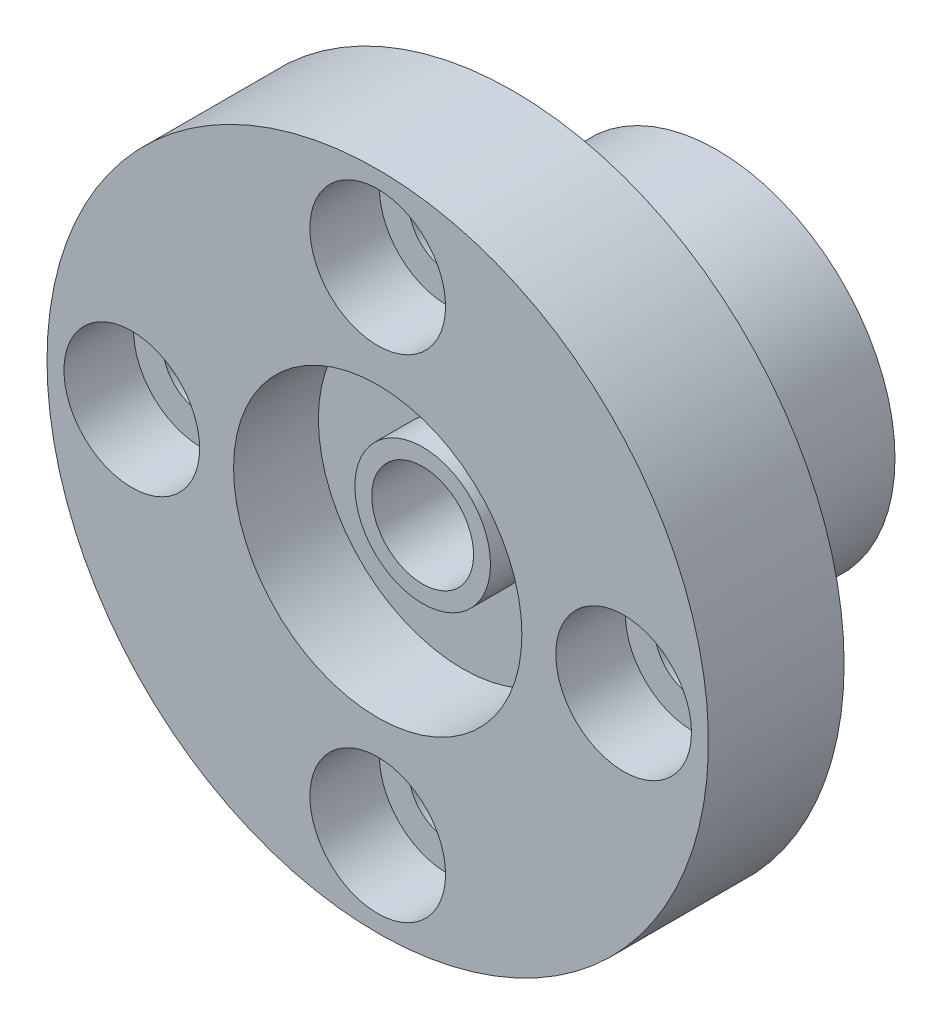
ISO-10303-21;
HEADER;
FILE_DESCRIPTION(('STEP AP214'),'2;1');
FILE_NAME('part.step','',(''),(''),'','','');
FILE_SCHEMA(('AUTOMOTIVE_DESIGN { 1 0 10303 214 1 1 1 1 }'));
ENDSEC;
DATA;
#1=APPLICATION_CONTEXT('core data for automotive mechanical design processes');
#2=APPLICATION_PROTOCOL_DEFINITION('international standard','automotive_design',2000,#1);
#3=PRODUCT_CONTEXT('',#1,'mechanical');
#4=PRODUCT('Part','Part','',(#3));
#5=PRODUCT_RELATED_PRODUCT_CATEGORY('part','',(#4));
#6=PRODUCT_DEFINITION_FORMATION('','',#4);
#7=PRODUCT_DEFINITION_CONTEXT('part definition',#1,'design');
#8=PRODUCT_DEFINITION('design','',#6,#7);
#9=PRODUCT_DEFINITION_SHAPE('','',#8);
#10=(LENGTH_UNIT() NAMED_UNIT(*) SI_UNIT(.MILLI.,.METRE.));
#11=(NAMED_UNIT(*) PLANE_ANGLE_UNIT() SI_UNIT($,.RADIAN.));
#12=(NAMED_UNIT(*) SI_UNIT($,.STERADIAN.) SOLID_ANGLE_UNIT());
#13=UNCERTAINTY_MEASURE_WITH_UNIT(LENGTH_MEASURE(1.E-05),#10,'distance_accuracy_value','');
#14=(GEOMETRIC_REPRESENTATION_CONTEXT(3) GLOBAL_UNCERTAINTY_ASSIGNED_CONTEXT((#13)) GLOBAL_UNIT_ASSIGNED_CONTEXT((#10,
#11,#12)) REPRESENTATION_CONTEXT('',''));
#15=CARTESIAN_POINT('',(0.,0.,0.));
#16=DIRECTION('',(0.,0.,1.));
#17=DIRECTION('',(1.,0.,0.));
#18=AXIS2_PLACEMENT_3D('',#15,#16,#17);
#19=CARTESIAN_POINT('',(0.,0.,10.65));
#20=DIRECTION('',(0.,0.,-1.));
#21=DIRECTION('',(-1.,0.,0.));
#22=AXIS2_PLACEMENT_3D('',#19,#20,#21);
#23=CYLINDRICAL_SURFACE('',#22,3.);
#24=CARTESIAN_POINT('',(0.,0.,-9.35));
#25=DIRECTION('',(0.,0.,-1.));
#26=DIRECTION('',(-1.,0.,0.));
#27=AXIS2_PLACEMENT_3D('',#24,#25,#26);
#28=CIRCLE('',#27,3.);
#29=CARTESIAN_POINT('',(-3.,0.,-9.35));
#30=VERTEX_POINT('',#29);
#31=EDGE_CURVE('E379',#30,#30,#28,.T.);
#32=ORIENTED_EDGE('',*,*,#31,.T.);
#33=EDGE_LOOP('',(#32));
#34=FACE_BOUND('',#33,.T.);
#35=CARTESIAN_POINT('',(0.,0.,5.35));
#36=DIRECTION('',(0.,0.,1.));
#37=DIRECTION('',(1.,0.,0.));
#38=AXIS2_PLACEMENT_3D('',#35,#36,#37);
#39=CIRCLE('',#38,3.);
#40=CARTESIAN_POINT('',(3.,0.,5.35));
#41=VERTEX_POINT('',#40);
#42=EDGE_CURVE('E369',#41,#41,#39,.T.);
#43=ORIENTED_EDGE('',*,*,#42,.T.);
#44=EDGE_LOOP('',(#43));
#45=FACE_BOUND('',#44,.T.);
#46=ADVANCED_FACE('F36',(#34,#45),#23,.F.);
#47=CARTESIAN_POINT('',(0.,0.,8.));
#48=DIRECTION('',(0.,0.,-1.));
#49=DIRECTION('',(-1.,0.,0.));
#50=AXIS2_PLACEMENT_3D('',#47,#48,#49);
#51=PLANE('',#50);
#52=CARTESIAN_POINT('',(0.,0.,8.));
#53=DIRECTION('',(0.,0.,1.));
#54=DIRECTION('',(1.,0.,0.));
#55=AXIS2_PLACEMENT_3D('',#52,#53,#54);
#56=CIRCLE('',#55,8.5);
#57=CARTESIAN_POINT('',(8.5,0.,8.));
#58=VERTEX_POINT('',#57);
#59=EDGE_CURVE('E371',#58,#58,#56,.T.);
#60=ORIENTED_EDGE('',*,*,#59,.F.);
#61=EDGE_LOOP('',(#60));
#62=FACE_BOUND('',#61,.T.);
#63=CARTESIAN_POINT('',(0.,14.5,8.));
#64=DIRECTION('',(0.,0.,1.));
#65=DIRECTION('',(1.,0.,0.));
#66=AXIS2_PLACEMENT_3D('',#63,#64,#65);
#67=CIRCLE('',#66,4.);
#68=CARTESIAN_POINT('',(4.,14.5,8.));
#69=VERTEX_POINT('',#68);
#70=EDGE_CURVE('E408',#69,#69,#67,.T.);
#71=ORIENTED_EDGE('',*,*,#70,.F.);
#72=EDGE_LOOP('',(#71));
#73=FACE_BOUND('',#72,.T.);
#74=CARTESIAN_POINT('',(14.5,0.,8.));
#75=DIRECTION('',(0.,0.,1.));
#76=DIRECTION('',(1.,0.,0.));
#77=AXIS2_PLACEMENT_3D('',#74,#75,#76);
#78=CIRCLE('',#77,4.);
#79=CARTESIAN_POINT('',(18.5,0.,8.));
#80=VERTEX_POINT('',#79);
#81=EDGE_CURVE('E414',#80,#80,#78,.T.);
#82=ORIENTED_EDGE('',*,*,#81,.F.);
#83=EDGE_LOOP('',(#82));
#84=FACE_BOUND('',#83,.T.);
#85=CARTESIAN_POINT('',(0.,-14.5,8.));
#86=DIRECTION('',(0.,0.,1.));
#87=DIRECTION('',(1.,0.,0.));
#88=AXIS2_PLACEMENT_3D('',#85,#86,#87);
#89=CIRCLE('',#88,4.);
#90=CARTESIAN_POINT('',(4.,-14.5,8.));
#91=VERTEX_POINT('',#90);
#92=EDGE_CURVE('E73',#91,#91,#89,.T.);
#93=ORIENTED_EDGE('',*,*,#92,.F.);
#94=EDGE_LOOP('',(#93));
#95=FACE_BOUND('',#94,.T.);
#96=CARTESIAN_POINT('',(-14.5,0.,8.));
#97=DIRECTION('',(0.,0.,1.));
#98=DIRECTION('',(1.,0.,0.));
#99=AXIS2_PLACEMENT_3D('',#96,#97,#98);
#100=CIRCLE('',#99,4.);
#101=CARTESIAN_POINT('',(-10.5,0.,8.));
#102=VERTEX_POINT('',#101);
#103=EDGE_CURVE('E64',#102,#102,#100,.T.);
#104=ORIENTED_EDGE('',*,*,#103,.F.);
#105=EDGE_LOOP('',(#104));
#106=FACE_BOUND('',#105,.T.);
#107=CARTESIAN_POINT('',(0.,0.,8.));
#108=DIRECTION('',(0.,0.,-1.));
#109=DIRECTION('',(-1.,0.,0.));
#110=AXIS2_PLACEMENT_3D('',#107,#108,#109);
#111=CIRCLE('',#110,19.5);
#112=CARTESIAN_POINT('',(-19.5,0.,8.));
#113=VERTEX_POINT('',#112);
#114=EDGE_CURVE('E77',#113,#113,#111,.T.);
#115=ORIENTED_EDGE('',*,*,#114,.F.);
#116=EDGE_LOOP('',(#115));
#117=FACE_BOUND('',#116,.T.);
#118=ADVANCED_FACE('F97',(#62,#73,#84,#95,#106,#117),#51,.F.);
#119=CARTESIAN_POINT('',(0.,0.,6.));
#120=DIRECTION('',(0.,0.,-1.));
#121=DIRECTION('',(-1.,0.,0.));
#122=AXIS2_PLACEMENT_3D('',#119,#120,#121);
#123=CYLINDRICAL_SURFACE('',#122,19.5);
#124=CARTESIAN_POINT('',(0.,0.,0.));
#125=DIRECTION('',(0.,0.,1.));
#126=DIRECTION('',(1.,0.,0.));
#127=AXIS2_PLACEMENT_3D('',#124,#125,#126);
#128=CIRCLE('',#127,19.5);
#129=CARTESIAN_POINT('',(19.5,0.,0.));
#130=VERTEX_POINT('',#129);
#131=EDGE_CURVE('E44',#130,#130,#128,.T.);
#132=ORIENTED_EDGE('',*,*,#131,.T.);
#133=EDGE_LOOP('',(#132));
#134=FACE_BOUND('',#133,.T.);
#135=ORIENTED_EDGE('',*,*,#114,.T.);
#136=EDGE_LOOP('',(#135));
#137=FACE_BOUND('',#136,.T.);
#138=ADVANCED_FACE('F38',(#134,#137),#123,.T.);
#139=CARTESIAN_POINT('',(0.,0.,0.));
#140=DIRECTION('',(0.,0.,1.));
#141=DIRECTION('',(1.,0.,0.));
#142=AXIS2_PLACEMENT_3D('',#139,#140,#141);
#143=PLANE('',#142);
#144=CARTESIAN_POINT('',(0.,14.5,0.));
#145=DIRECTION('',(0.,0.,1.));
#146=DIRECTION('',(1.,0.,0.));
#147=AXIS2_PLACEMENT_3D('',#144,#145,#146);
#148=CIRCLE('',#147,2.25);
#149=CARTESIAN_POINT('',(2.25,14.5,0.));
#150=VERTEX_POINT('',#149);
#151=EDGE_CURVE('E40',#150,#150,#148,.T.);
#152=ORIENTED_EDGE('',*,*,#151,.T.);
#153=EDGE_LOOP('',(#152));
#154=FACE_BOUND('',#153,.T.);
#155=CARTESIAN_POINT('',(14.5,0.,0.));
#156=DIRECTION('',(0.,0.,1.));
#157=DIRECTION('',(1.,0.,0.));
#158=AXIS2_PLACEMENT_3D('',#155,#156,#157);
#159=CIRCLE('',#158,2.25);
#160=CARTESIAN_POINT('',(16.75,0.,0.));
#161=VERTEX_POINT('',#160);
#162=EDGE_CURVE('E59',#161,#161,#159,.T.);
#163=ORIENTED_EDGE('',*,*,#162,.T.);
#164=EDGE_LOOP('',(#163));
#165=FACE_BOUND('',#164,.T.);
#166=CARTESIAN_POINT('',(0.,-14.5,0.));
#167=DIRECTION('',(0.,0.,1.));
#168=DIRECTION('',(1.,0.,0.));
#169=AXIS2_PLACEMENT_3D('',#166,#167,#168);
#170=CIRCLE('',#169,2.25);
#171=CARTESIAN_POINT('',(2.25,-14.5,0.));
#172=VERTEX_POINT('',#171);
#173=EDGE_CURVE('E56',#172,#172,#170,.T.);
#174=ORIENTED_EDGE('',*,*,#173,.T.);
#175=EDGE_LOOP('',(#174));
#176=FACE_BOUND('',#175,.T.);
#177=CARTESIAN_POINT('',(-14.5,0.,0.));
#178=DIRECTION('',(0.,0.,1.));
#179=DIRECTION('',(1.,0.,0.));
#180=AXIS2_PLACEMENT_3D('',#177,#178,#179);
#181=CIRCLE('',#180,2.25);
#182=CARTESIAN_POINT('',(-12.25,0.,0.));
#183=VERTEX_POINT('',#182);
#184=EDGE_CURVE('E53',#183,#183,#181,.T.);
#185=ORIENTED_EDGE('',*,*,#184,.T.);
#186=EDGE_LOOP('',(#185));
#187=FACE_BOUND('',#186,.T.);
#188=CARTESIAN_POINT('',(0.,0.,0.));
#189=DIRECTION('',(0.,0.,1.));
#190=DIRECTION('',(1.,0.,0.));
#191=AXIS2_PLACEMENT_3D('',#188,#189,#190);
#192=CIRCLE('',#191,10.5);
#193=CARTESIAN_POINT('',(10.5,0.,0.));
#194=VERTEX_POINT('',#193);
#195=EDGE_CURVE('E10',#194,#194,#192,.F.);
#196=ORIENTED_EDGE('',*,*,#195,.F.);
#197=EDGE_LOOP('',(#196));
#198=FACE_BOUND('',#197,.T.);
#199=ORIENTED_EDGE('',*,*,#131,.F.);
#200=EDGE_LOOP('',(#199));
#201=FACE_BOUND('',#200,.T.);
#202=ADVANCED_FACE('F87',(#154,#165,#176,#187,#198,#201),#143,.F.);
#203=CARTESIAN_POINT('',(0.,0.,-12.));
#204=DIRECTION('',(0.,0.,1.));
#205=DIRECTION('',(1.,0.,0.));
#206=AXIS2_PLACEMENT_3D('',#203,#204,#205);
#207=CYLINDRICAL_SURFACE('',#206,10.5);
#208=CARTESIAN_POINT('',(0.,0.,-12.));
#209=DIRECTION('',(0.,0.,-1.));
#210=DIRECTION('',(-1.,0.,0.));
#211=AXIS2_PLACEMENT_3D('',#208,#209,#210);
#212=CIRCLE('',#211,10.5);
#213=CARTESIAN_POINT('',(-10.5,0.,-12.));
#214=VERTEX_POINT('',#213);
#215=EDGE_CURVE('E49',#214,#214,#212,.T.);
#216=ORIENTED_EDGE('',*,*,#215,.F.);
#217=EDGE_LOOP('',(#216));
#218=FACE_BOUND('',#217,.T.);
#219=ORIENTED_EDGE('',*,*,#195,.T.);
#220=EDGE_LOOP('',(#219));
#221=FACE_BOUND('',#220,.T.);
#222=ADVANCED_FACE('F85',(#218,#221),#207,.T.);
#223=CARTESIAN_POINT('',(0.,0.,-12.));
#224=DIRECTION('',(0.,0.,-1.));
#225=DIRECTION('',(-1.,0.,0.));
#226=AXIS2_PLACEMENT_3D('',#223,#224,#225);
#227=PLANE('',#226);
#228=CARTESIAN_POINT('',(0.,0.,-12.));
#229=DIRECTION('',(0.,0.,-1.));
#230=DIRECTION('',(-1.,0.,0.));
#231=AXIS2_PLACEMENT_3D('',#228,#229,#230);
#232=CIRCLE('',#231,8.5);
#233=CARTESIAN_POINT('',(-8.5,0.,-12.));
#234=VERTEX_POINT('',#233);
#235=EDGE_CURVE('E387',#234,#234,#232,.T.);
#236=ORIENTED_EDGE('',*,*,#235,.F.);
#237=EDGE_LOOP('',(#236));
#238=FACE_BOUND('',#237,.T.);
#239=ORIENTED_EDGE('',*,*,#215,.T.);
#240=EDGE_LOOP('',(#239));
#241=FACE_BOUND('',#240,.T.);
#242=ADVANCED_FACE('F83',(#238,#241),#227,.T.);
#243=CARTESIAN_POINT('',(-14.5,0.,3.9));
#244=DIRECTION('',(0.,0.,1.));
#245=DIRECTION('',(1.,0.,0.));
#246=AXIS2_PLACEMENT_3D('',#243,#244,#245);
#247=CYLINDRICAL_SURFACE('',#246,4.);
#248=CARTESIAN_POINT('',(-14.5,0.,3.9));
#249=DIRECTION('',(0.,0.,1.));
#250=DIRECTION('',(1.,0.,0.));
#251=AXIS2_PLACEMENT_3D('',#248,#249,#250);
#252=CIRCLE('',#251,4.);
#253=CARTESIAN_POINT('',(-10.5,0.,3.9));
#254=VERTEX_POINT('',#253);
#255=EDGE_CURVE('E68',#254,#254,#252,.T.);
#256=ORIENTED_EDGE('',*,*,#255,.F.);
#257=EDGE_LOOP('',(#256));
#258=FACE_BOUND('',#257,.T.);
#259=ORIENTED_EDGE('',*,*,#103,.T.);
#260=EDGE_LOOP('',(#259));
#261=FACE_BOUND('',#260,.T.);
#262=ADVANCED_FACE('F93',(#258,#261),#247,.F.);
#263=CARTESIAN_POINT('',(-14.5,0.,3.9));
#264=DIRECTION('',(0.,0.,1.));
#265=DIRECTION('',(1.,0.,0.));
#266=AXIS2_PLACEMENT_3D('',#263,#264,#265);
#267=PLANE('',#266);
#268=CARTESIAN_POINT('',(-14.5,0.,3.9));
#269=DIRECTION('',(0.,0.,1.));
#270=DIRECTION('',(1.,0.,0.));
#271=AXIS2_PLACEMENT_3D('',#268,#269,#270);
#272=CIRCLE('',#271,2.25);
#273=CARTESIAN_POINT('',(-12.25,0.,3.9));
#274=VERTEX_POINT('',#273);
#275=EDGE_CURVE('E393',#274,#274,#272,.T.);
#276=ORIENTED_EDGE('',*,*,#275,.F.);
#277=EDGE_LOOP('',(#276));
#278=FACE_BOUND('',#277,.T.);
#279=ORIENTED_EDGE('',*,*,#255,.T.);
#280=EDGE_LOOP('',(#279));
#281=FACE_BOUND('',#280,.T.);
#282=ADVANCED_FACE('F167',(#278,#281),#267,.T.);
#283=CARTESIAN_POINT('',(0.,-14.5,3.9));
#284=DIRECTION('',(0.,0.,1.));
#285=DIRECTION('',(1.,0.,0.));
#286=AXIS2_PLACEMENT_3D('',#283,#284,#285);
#287=CYLINDRICAL_SURFACE('',#286,4.);
#288=CARTESIAN_POINT('',(0.,-14.5,3.9));
#289=DIRECTION('',(0.,0.,1.));
#290=DIRECTION('',(1.,0.,0.));
#291=AXIS2_PLACEMENT_3D('',#288,#289,#290);
#292=CIRCLE('',#291,4.);
#293=CARTESIAN_POINT('',(4.,-14.5,3.9));
#294=VERTEX_POINT('',#293);
#295=EDGE_CURVE('E417',#294,#294,#292,.T.);
#296=ORIENTED_EDGE('',*,*,#295,.F.);
#297=EDGE_LOOP('',(#296));
#298=FACE_BOUND('',#297,.T.);
#299=ORIENTED_EDGE('',*,*,#92,.T.);
#300=EDGE_LOOP('',(#299));
#301=FACE_BOUND('',#300,.T.);
#302=ADVANCED_FACE('F163',(#298,#301),#287,.F.);
#303=CARTESIAN_POINT('',(0.,-14.5,3.9));
#304=DIRECTION('',(0.,0.,1.));
#305=DIRECTION('',(1.,0.,0.));
#306=AXIS2_PLACEMENT_3D('',#303,#304,#305);
#307=PLANE('',#306);
#308=CARTESIAN_POINT('',(0.,-14.5,3.9));
#309=DIRECTION('',(0.,0.,1.));
#310=DIRECTION('',(1.,0.,0.));
#311=AXIS2_PLACEMENT_3D('',#308,#309,#310);
#312=CIRCLE('',#311,2.25);
#313=CARTESIAN_POINT('',(2.25,-14.5,3.9));
#314=VERTEX_POINT('',#313);
#315=EDGE_CURVE('E401',#314,#314,#312,.T.);
#316=ORIENTED_EDGE('',*,*,#315,.F.);
#317=EDGE_LOOP('',(#316));
#318=FACE_BOUND('',#317,.T.);
#319=ORIENTED_EDGE('',*,*,#295,.T.);
#320=EDGE_LOOP('',(#319));
#321=FACE_BOUND('',#320,.T.);
#322=ADVANCED_FACE('F159',(#318,#321),#307,.T.);
#323=CARTESIAN_POINT('',(14.5,0.,3.9));
#324=DIRECTION('',(0.,0.,1.));
#325=DIRECTION('',(1.,0.,0.));
#326=AXIS2_PLACEMENT_3D('',#323,#324,#325);
#327=CYLINDRICAL_SURFACE('',#326,4.);
#328=CARTESIAN_POINT('',(14.5,0.,3.9));
#329=DIRECTION('',(0.,0.,1.));
#330=DIRECTION('',(1.,0.,0.));
#331=AXIS2_PLACEMENT_3D('',#328,#329,#330);
#332=CIRCLE('',#331,4.);
#333=CARTESIAN_POINT('',(18.5,0.,3.9));
#334=VERTEX_POINT('',#333);
#335=EDGE_CURVE('E411',#334,#334,#332,.T.);
#336=ORIENTED_EDGE('',*,*,#335,.F.);
#337=EDGE_LOOP('',(#336));
#338=FACE_BOUND('',#337,.T.);
#339=ORIENTED_EDGE('',*,*,#81,.T.);
#340=EDGE_LOOP('',(#339));
#341=FACE_BOUND('',#340,.T.);
#342=ADVANCED_FACE('F155',(#338,#341),#327,.F.);
#343=CARTESIAN_POINT('',(14.5,0.,3.9));
#344=DIRECTION('',(0.,0.,1.));
#345=DIRECTION('',(1.,0.,0.));
#346=AXIS2_PLACEMENT_3D('',#343,#344,#345);
#347=PLANE('',#346);
#348=CARTESIAN_POINT('',(14.5,0.,3.9));
#349=DIRECTION('',(0.,0.,1.));
#350=DIRECTION('',(1.,0.,0.));
#351=AXIS2_PLACEMENT_3D('',#348,#349,#350);
#352=CIRCLE('',#351,2.25);
#353=CARTESIAN_POINT('',(16.75,0.,3.9));
#354=VERTEX_POINT('',#353);
#355=EDGE_CURVE('E398',#354,#354,#352,.T.);
#356=ORIENTED_EDGE('',*,*,#355,.F.);
#357=EDGE_LOOP('',(#356));
#358=FACE_BOUND('',#357,.T.);
#359=ORIENTED_EDGE('',*,*,#335,.T.);
#360=EDGE_LOOP('',(#359));
#361=FACE_BOUND('',#360,.T.);
#362=ADVANCED_FACE('F151',(#358,#361),#347,.T.);
#363=CARTESIAN_POINT('',(0.,14.5,3.9));
#364=DIRECTION('',(0.,0.,1.));
#365=DIRECTION('',(1.,0.,0.));
#366=AXIS2_PLACEMENT_3D('',#363,#364,#365);
#367=CYLINDRICAL_SURFACE('',#366,4.);
#368=CARTESIAN_POINT('',(0.,14.5,3.9));
#369=DIRECTION('',(0.,0.,1.));
#370=DIRECTION('',(1.,0.,0.));
#371=AXIS2_PLACEMENT_3D('',#368,#369,#370);
#372=CIRCLE('',#371,4.);
#373=CARTESIAN_POINT('',(4.,14.5,3.9));
#374=VERTEX_POINT('',#373);
#375=EDGE_CURVE('E79',#374,#374,#372,.T.);
#376=ORIENTED_EDGE('',*,*,#375,.F.);
#377=EDGE_LOOP('',(#376));
#378=FACE_BOUND('',#377,.T.);
#379=ORIENTED_EDGE('',*,*,#70,.T.);
#380=EDGE_LOOP('',(#379));
#381=FACE_BOUND('',#380,.T.);
#382=ADVANCED_FACE('F147',(#378,#381),#367,.F.);
#383=CARTESIAN_POINT('',(0.,14.5,3.9));
#384=DIRECTION('',(0.,0.,1.));
#385=DIRECTION('',(1.,0.,0.));
#386=AXIS2_PLACEMENT_3D('',#383,#384,#385);
#387=PLANE('',#386);
#388=CARTESIAN_POINT('',(0.,14.5,3.9));
#389=DIRECTION('',(0.,0.,1.));
#390=DIRECTION('',(1.,0.,0.));
#391=AXIS2_PLACEMENT_3D('',#388,#389,#390);
#392=CIRCLE('',#391,2.25);
#393=CARTESIAN_POINT('',(2.25,14.5,3.9));
#394=VERTEX_POINT('',#393);
#395=EDGE_CURVE('E57',#394,#394,#392,.T.);
#396=ORIENTED_EDGE('',*,*,#395,.F.);
#397=EDGE_LOOP('',(#396));
#398=FACE_BOUND('',#397,.T.);
#399=ORIENTED_EDGE('',*,*,#375,.T.);
#400=EDGE_LOOP('',(#399));
#401=FACE_BOUND('',#400,.T.);
#402=ADVANCED_FACE('F143',(#398,#401),#387,.T.);
#403=CARTESIAN_POINT('',(-14.5,0.,-0.199999999999999));
#404=DIRECTION('',(0.,0.,1.));
#405=DIRECTION('',(1.,0.,0.));
#406=AXIS2_PLACEMENT_3D('',#403,#404,#405);
#407=CYLINDRICAL_SURFACE('',#406,2.25);
#408=ORIENTED_EDGE('',*,*,#275,.T.);
#409=EDGE_LOOP('',(#408));
#410=FACE_BOUND('',#409,.T.);
#411=ORIENTED_EDGE('',*,*,#184,.F.);
#412=EDGE_LOOP('',(#411));
#413=FACE_BOUND('',#412,.T.);
#414=ADVANCED_FACE('F139',(#410,#413),#407,.F.);
#415=CARTESIAN_POINT('',(0.,-14.5,-0.199999999999999));
#416=DIRECTION('',(0.,0.,1.));
#417=DIRECTION('',(1.,0.,0.));
#418=AXIS2_PLACEMENT_3D('',#415,#416,#417);
#419=CYLINDRICAL_SURFACE('',#418,2.25);
#420=ORIENTED_EDGE('',*,*,#315,.T.);
#421=EDGE_LOOP('',(#420));
#422=FACE_BOUND('',#421,.T.);
#423=ORIENTED_EDGE('',*,*,#173,.F.);
#424=EDGE_LOOP('',(#423));
#425=FACE_BOUND('',#424,.T.);
#426=ADVANCED_FACE('F135',(#422,#425),#419,.F.);
#427=CARTESIAN_POINT('',(14.5,0.,-0.199999999999999));
#428=DIRECTION('',(0.,0.,1.));
#429=DIRECTION('',(1.,0.,0.));
#430=AXIS2_PLACEMENT_3D('',#427,#428,#429);
#431=CYLINDRICAL_SURFACE('',#430,2.25);
#432=ORIENTED_EDGE('',*,*,#355,.T.);
#433=EDGE_LOOP('',(#432));
#434=FACE_BOUND('',#433,.T.);
#435=ORIENTED_EDGE('',*,*,#162,.F.);
#436=EDGE_LOOP('',(#435));
#437=FACE_BOUND('',#436,.T.);
#438=ADVANCED_FACE('F131',(#434,#437),#431,.F.);
#439=CARTESIAN_POINT('',(0.,14.5,-0.199999999999999));
#440=DIRECTION('',(0.,0.,1.));
#441=DIRECTION('',(1.,0.,0.));
#442=AXIS2_PLACEMENT_3D('',#439,#440,#441);
#443=CYLINDRICAL_SURFACE('',#442,2.25);
#444=ORIENTED_EDGE('',*,*,#395,.T.);
#445=EDGE_LOOP('',(#444));
#446=FACE_BOUND('',#445,.T.);
#447=ORIENTED_EDGE('',*,*,#151,.F.);
#448=EDGE_LOOP('',(#447));
#449=FACE_BOUND('',#448,.T.);
#450=ADVANCED_FACE('F127',(#446,#449),#443,.F.);
#451=CARTESIAN_POINT('',(0.,0.,-7.));
#452=DIRECTION('',(0.,0.,-1.));
#453=DIRECTION('',(-1.,0.,0.));
#454=AXIS2_PLACEMENT_3D('',#451,#452,#453);
#455=CYLINDRICAL_SURFACE('',#454,8.5);
#456=CARTESIAN_POINT('',(0.,0.,-7.));
#457=DIRECTION('',(0.,0.,-1.));
#458=DIRECTION('',(-1.,0.,0.));
#459=AXIS2_PLACEMENT_3D('',#456,#457,#458);
#460=CIRCLE('',#459,8.5);
#461=CARTESIAN_POINT('',(-8.5,0.,-7.));
#462=VERTEX_POINT('',#461);
#463=EDGE_CURVE('E390',#462,#462,#460,.T.);
#464=ORIENTED_EDGE('',*,*,#463,.F.);
#465=EDGE_LOOP('',(#464));
#466=FACE_BOUND('',#465,.T.);
#467=ORIENTED_EDGE('',*,*,#235,.T.);
#468=EDGE_LOOP('',(#467));
#469=FACE_BOUND('',#468,.T.);
#470=ADVANCED_FACE('F123',(#466,#469),#455,.F.);
#471=CARTESIAN_POINT('',(0.,0.,-7.));
#472=DIRECTION('',(0.,0.,-1.));
#473=DIRECTION('',(-1.,0.,0.));
#474=AXIS2_PLACEMENT_3D('',#471,#472,#473);
#475=PLANE('',#474);
#476=CARTESIAN_POINT('',(0.,0.,-7.));
#477=DIRECTION('',(0.,0.,-1.));
#478=DIRECTION('',(-1.,0.,0.));
#479=AXIS2_PLACEMENT_3D('',#476,#477,#478);
#480=CIRCLE('',#479,4.);
#481=CARTESIAN_POINT('',(-4.,0.,-7.));
#482=VERTEX_POINT('',#481);
#483=EDGE_CURVE('E383',#482,#482,#480,.T.);
#484=ORIENTED_EDGE('',*,*,#483,.F.);
#485=EDGE_LOOP('',(#484));
#486=FACE_BOUND('',#485,.T.);
#487=ORIENTED_EDGE('',*,*,#463,.T.);
#488=EDGE_LOOP('',(#487));
#489=FACE_BOUND('',#488,.T.);
#490=ADVANCED_FACE('F119',(#486,#489),#475,.T.);
#491=CARTESIAN_POINT('',(0.,0.,-9.35));
#492=DIRECTION('',(0.,0.,1.));
#493=DIRECTION('',(1.,0.,0.));
#494=AXIS2_PLACEMENT_3D('',#491,#492,#493);
#495=CYLINDRICAL_SURFACE('',#494,4.);
#496=CARTESIAN_POINT('',(0.,0.,-9.35));
#497=DIRECTION('',(0.,0.,-1.));
#498=DIRECTION('',(-1.,0.,0.));
#499=AXIS2_PLACEMENT_3D('',#496,#497,#498);
#500=CIRCLE('',#499,4.);
#501=CARTESIAN_POINT('',(-4.,0.,-9.35));
#502=VERTEX_POINT('',#501);
#503=EDGE_CURVE('E384',#502,#502,#500,.T.);
#504=ORIENTED_EDGE('',*,*,#503,.F.);
#505=EDGE_LOOP('',(#504));
#506=FACE_BOUND('',#505,.T.);
#507=ORIENTED_EDGE('',*,*,#483,.T.);
#508=EDGE_LOOP('',(#507));
#509=FACE_BOUND('',#508,.T.);
#510=ADVANCED_FACE('F115',(#506,#509),#495,.T.);
#511=CARTESIAN_POINT('',(0.,0.,-9.35));
#512=DIRECTION('',(0.,0.,-1.));
#513=DIRECTION('',(-1.,0.,0.));
#514=AXIS2_PLACEMENT_3D('',#511,#512,#513);
#515=PLANE('',#514);
#516=ORIENTED_EDGE('',*,*,#31,.F.);
#517=EDGE_LOOP('',(#516));
#518=FACE_BOUND('',#517,.T.);
#519=ORIENTED_EDGE('',*,*,#503,.T.);
#520=EDGE_LOOP('',(#519));
#521=FACE_BOUND('',#520,.T.);
#522=ADVANCED_FACE('F111',(#518,#521),#515,.T.);
#523=CARTESIAN_POINT('',(0.,0.,3.));
#524=DIRECTION('',(0.,0.,1.));
#525=DIRECTION('',(1.,0.,0.));
#526=AXIS2_PLACEMENT_3D('',#523,#524,#525);
#527=PLANE('',#526);
#528=CARTESIAN_POINT('',(0.,0.,3.));
#529=DIRECTION('',(0.,0.,1.));
#530=DIRECTION('',(1.,0.,0.));
#531=AXIS2_PLACEMENT_3D('',#528,#529,#530);
#532=CIRCLE('',#531,4.);
#533=CARTESIAN_POINT('',(4.,0.,3.));
#534=VERTEX_POINT('',#533);
#535=EDGE_CURVE('E368',#534,#534,#532,.T.);
#536=ORIENTED_EDGE('',*,*,#535,.F.);
#537=EDGE_LOOP('',(#536));
#538=FACE_BOUND('',#537,.T.);
#539=CARTESIAN_POINT('',(0.,0.,3.));
#540=DIRECTION('',(0.,0.,1.));
#541=DIRECTION('',(1.,0.,0.));
#542=AXIS2_PLACEMENT_3D('',#539,#540,#541);
#543=CIRCLE('',#542,8.5);
#544=CARTESIAN_POINT('',(8.5,0.,3.));
#545=VERTEX_POINT('',#544);
#546=EDGE_CURVE('E376',#545,#545,#543,.T.);
#547=ORIENTED_EDGE('',*,*,#546,.T.);
#548=EDGE_LOOP('',(#547));
#549=FACE_BOUND('',#548,.T.);
#550=ADVANCED_FACE('F114',(#538,#549),#527,.T.);
#551=CARTESIAN_POINT('',(0.,0.,3.));
#552=DIRECTION('',(0.,0.,1.));
#553=DIRECTION('',(1.,0.,0.));
#554=AXIS2_PLACEMENT_3D('',#551,#552,#553);
#555=CYLINDRICAL_SURFACE('',#554,8.5);
#556=ORIENTED_EDGE('',*,*,#546,.F.);
#557=EDGE_LOOP('',(#556));
#558=FACE_BOUND('',#557,.T.);
#559=ORIENTED_EDGE('',*,*,#59,.T.);
#560=EDGE_LOOP('',(#559));
#561=FACE_BOUND('',#560,.T.);
#562=ADVANCED_FACE('F109',(#558,#561),#555,.F.);
#563=CARTESIAN_POINT('',(0.,0.,5.35));
#564=DIRECTION('',(0.,0.,1.));
#565=DIRECTION('',(1.,0.,0.));
#566=AXIS2_PLACEMENT_3D('',#563,#564,#565);
#567=PLANE('',#566);
#568=ORIENTED_EDGE('',*,*,#42,.F.);
#569=EDGE_LOOP('',(#568));
#570=FACE_BOUND('',#569,.T.);
#571=CARTESIAN_POINT('',(0.,0.,5.35));
#572=DIRECTION('',(0.,0.,1.));
#573=DIRECTION('',(1.,0.,0.));
#574=AXIS2_PLACEMENT_3D('',#571,#572,#573);
#575=CIRCLE('',#574,4.);
#576=CARTESIAN_POINT('',(4.,0.,5.35));
#577=VERTEX_POINT('',#576);
#578=EDGE_CURVE('E365',#577,#577,#575,.T.);
#579=ORIENTED_EDGE('',*,*,#578,.T.);
#580=EDGE_LOOP('',(#579));
#581=FACE_BOUND('',#580,.T.);
#582=ADVANCED_FACE('F256',(#570,#581),#567,.T.);
#583=CARTESIAN_POINT('',(0.,0.,5.35));
#584=DIRECTION('',(0.,0.,-1.));
#585=DIRECTION('',(-1.,0.,0.));
#586=AXIS2_PLACEMENT_3D('',#583,#584,#585);
#587=CYLINDRICAL_SURFACE('',#586,4.);
#588=ORIENTED_EDGE('',*,*,#578,.F.);
#589=EDGE_LOOP('',(#588));
#590=FACE_BOUND('',#589,.T.);
#591=ORIENTED_EDGE('',*,*,#535,.T.);
#592=EDGE_LOOP('',(#591));
#593=FACE_BOUND('',#592,.T.);
#594=ADVANCED_FACE('F263',(#590,#593),#587,.T.);
#595=CLOSED_SHELL('',(#46,#118,#138,#202,#222,#242,#262,#282,#302,#322,#342,#362,#382,#402,#414,
#426,#438,#450,#470,#490,#510,#522,#550,#562,#582,#594));
#596=MANIFOLD_SOLID_BREP('B2',#595);
#597=ADVANCED_BREP_SHAPE_REPRESENTATION('',(#18,#596),#14);
#598=SHAPE_DEFINITION_REPRESENTATION(#9,#597);
ENDSEC;
END-ISO-10303-21;
